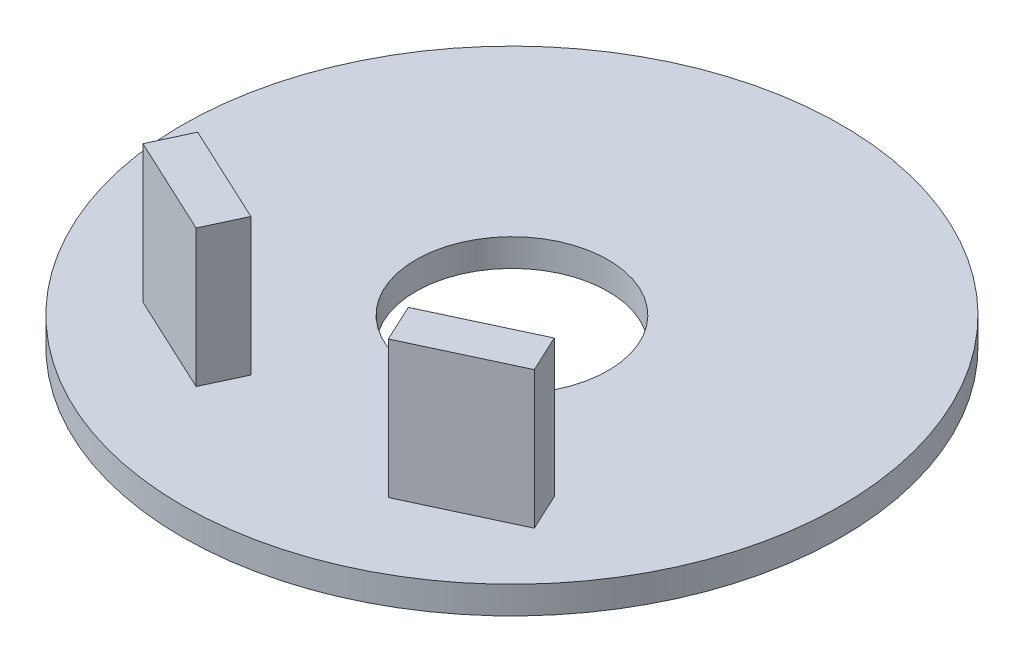
ISO-10303-21;
HEADER;
FILE_DESCRIPTION(('STEP AP214'),'2;1');
FILE_NAME('part.step','',(''),(''),'','','');
FILE_SCHEMA(('AUTOMOTIVE_DESIGN { 1 0 10303 214 1 1 1 1 }'));
ENDSEC;
DATA;
#1=APPLICATION_CONTEXT('core data for automotive mechanical design processes');
#2=APPLICATION_PROTOCOL_DEFINITION('international standard','automotive_design',2000,#1);
#3=PRODUCT_CONTEXT('',#1,'mechanical');
#4=PRODUCT('Part','Part','',(#3));
#5=PRODUCT_RELATED_PRODUCT_CATEGORY('part','',(#4));
#6=PRODUCT_DEFINITION_FORMATION('','',#4);
#7=PRODUCT_DEFINITION_CONTEXT('part definition',#1,'design');
#8=PRODUCT_DEFINITION('design','',#6,#7);
#9=PRODUCT_DEFINITION_SHAPE('','',#8);
#10=(LENGTH_UNIT() NAMED_UNIT(*) SI_UNIT(.MILLI.,.METRE.));
#11=(NAMED_UNIT(*) PLANE_ANGLE_UNIT() SI_UNIT($,.RADIAN.));
#12=(NAMED_UNIT(*) SI_UNIT($,.STERADIAN.) SOLID_ANGLE_UNIT());
#13=UNCERTAINTY_MEASURE_WITH_UNIT(LENGTH_MEASURE(1.E-05),#10,'distance_accuracy_value','');
#14=(GEOMETRIC_REPRESENTATION_CONTEXT(3) GLOBAL_UNCERTAINTY_ASSIGNED_CONTEXT((#13)) GLOBAL_UNIT_ASSIGNED_CONTEXT((#10,
#11,#12)) REPRESENTATION_CONTEXT('',''));
#15=CARTESIAN_POINT('',(0.,0.,0.));
#16=DIRECTION('',(0.,0.,1.));
#17=DIRECTION('',(1.,0.,0.));
#18=AXIS2_PLACEMENT_3D('',#15,#16,#17);
#19=CARTESIAN_POINT('',(0.,0.5,0.));
#20=DIRECTION('',(0.,1.,0.));
#21=DIRECTION('',(0.,0.,1.));
#22=AXIS2_PLACEMENT_3D('',#19,#20,#21);
#23=PLANE('',#22);
#24=CARTESIAN_POINT('',(0.,0.5,0.));
#25=DIRECTION('',(0.,1.,0.));
#26=DIRECTION('',(0.,0.,1.));
#27=AXIS2_PLACEMENT_3D('',#24,#25,#26);
#28=CIRCLE('',#27,12.);
#29=CARTESIAN_POINT('',(0.,0.5,12.));
#30=VERTEX_POINT('',#29);
#31=EDGE_CURVE('E11',#30,#30,#28,.T.);
#32=ORIENTED_EDGE('',*,*,#31,.T.);
#33=EDGE_LOOP('',(#32));
#34=FACE_BOUND('',#33,.T.);
#35=CARTESIAN_POINT('',(0.,0.5,0.));
#36=DIRECTION('',(0.,1.,0.));
#37=DIRECTION('',(0.,0.,1.));
#38=AXIS2_PLACEMENT_3D('',#35,#36,#37);
#39=CIRCLE('',#38,3.5);
#40=CARTESIAN_POINT('',(0.,0.5,3.5));
#41=VERTEX_POINT('',#40);
#42=EDGE_CURVE('E168',#41,#41,#39,.T.);
#43=ORIENTED_EDGE('',*,*,#42,.F.);
#44=EDGE_LOOP('',(#43));
#45=FACE_BOUND('',#44,.T.);
#46=DIRECTION('',(0.906307787036653,0.,0.422618261740693));
#47=VECTOR('',#46,1.);
#48=CARTESIAN_POINT('',(-3.5,0.5,8.));
#49=LINE('',#48,#47);
#50=CARTESIAN_POINT('',(-7.12523114814661,0.5,6.30952695303723));
#51=VERTEX_POINT('',#50);
#52=CARTESIAN_POINT('',(-3.5,0.5,8.));
#53=VERTEX_POINT('',#52);
#54=EDGE_CURVE('E139',#51,#53,#49,.T.);
#55=ORIENTED_EDGE('',*,*,#54,.F.);
#56=DIRECTION('',(-0.422618261740693,0.,0.906307787036653));
#57=VECTOR('',#56,1.);
#58=CARTESIAN_POINT('',(-7.12523114814661,0.5,6.30952695303723));
#59=LINE('',#58,#57);
#60=CARTESIAN_POINT('',(-6.49130375553557,0.5,4.95006527248225));
#61=VERTEX_POINT('',#60);
#62=EDGE_CURVE('E136',#61,#51,#59,.T.);
#63=ORIENTED_EDGE('',*,*,#62,.F.);
#64=DIRECTION('',(-0.906307787036653,0.,-0.422618261740693));
#65=VECTOR('',#64,1.);
#66=CARTESIAN_POINT('',(-6.49130375553557,0.5,4.95006527248225));
#67=LINE('',#66,#65);
#68=CARTESIAN_POINT('',(-2.86607260738896,0.5,6.64053831944502));
#69=VERTEX_POINT('',#68);
#70=EDGE_CURVE('E148',#69,#61,#67,.T.);
#71=ORIENTED_EDGE('',*,*,#70,.F.);
#72=DIRECTION('',(0.422618261740693,0.,-0.906307787036653));
#73=VECTOR('',#72,1.);
#74=CARTESIAN_POINT('',(-2.86607260738896,0.5,6.64053831944502));
#75=LINE('',#74,#73);
#76=EDGE_CURVE('E156',#53,#69,#75,.T.);
#77=ORIENTED_EDGE('',*,*,#76,.F.);
#78=EDGE_LOOP('',(#55,#63,#71,#77));
#79=FACE_BOUND('',#78,.T.);
#80=DIRECTION('',(-0.422618261740693,0.,-0.906307787036653));
#81=VECTOR('',#80,1.);
#82=CARTESIAN_POINT('',(7.12523114814661,0.5,6.30952695303723));
#83=LINE('',#82,#81);
#84=CARTESIAN_POINT('',(7.12523114814661,0.5,6.30952695303723));
#85=VERTEX_POINT('',#84);
#86=CARTESIAN_POINT('',(6.49130375553557,0.5,4.95006527248225));
#87=VERTEX_POINT('',#86);
#88=EDGE_CURVE('E205',#85,#87,#83,.T.);
#89=ORIENTED_EDGE('',*,*,#88,.F.);
#90=DIRECTION('',(0.906307787036653,0.,-0.422618261740693));
#91=VECTOR('',#90,1.);
#92=CARTESIAN_POINT('',(3.5,0.5,8.));
#93=LINE('',#92,#91);
#94=CARTESIAN_POINT('',(3.5,0.5,8.));
#95=VERTEX_POINT('',#94);
#96=EDGE_CURVE('E134',#95,#85,#93,.T.);
#97=ORIENTED_EDGE('',*,*,#96,.F.);
#98=DIRECTION('',(0.422618261740693,0.,0.906307787036653));
#99=VECTOR('',#98,1.);
#100=CARTESIAN_POINT('',(2.86607260738896,0.5,6.64053831944502));
#101=LINE('',#100,#99);
#102=CARTESIAN_POINT('',(2.86607260738896,0.5,6.64053831944502));
#103=VERTEX_POINT('',#102);
#104=EDGE_CURVE('E130',#103,#95,#101,.T.);
#105=ORIENTED_EDGE('',*,*,#104,.F.);
#106=DIRECTION('',(-0.906307787036653,0.,0.422618261740693));
#107=VECTOR('',#106,1.);
#108=CARTESIAN_POINT('',(6.49130375553557,0.5,4.95006527248225));
#109=LINE('',#108,#107);
#110=EDGE_CURVE('E207',#87,#103,#109,.T.);
#111=ORIENTED_EDGE('',*,*,#110,.F.);
#112=EDGE_LOOP('',(#89,#97,#105,#111));
#113=FACE_BOUND('',#112,.T.);
#114=ADVANCED_FACE('F45',(#34,#45,#79,#113),#23,.T.);
#115=CARTESIAN_POINT('',(0.,-0.5,0.));
#116=DIRECTION('',(0.,1.,0.));
#117=DIRECTION('',(0.,0.,1.));
#118=AXIS2_PLACEMENT_3D('',#115,#116,#117);
#119=PLANE('',#118);
#120=CARTESIAN_POINT('',(0.,-0.5,0.));
#121=DIRECTION('',(0.,1.,0.));
#122=DIRECTION('',(0.,0.,1.));
#123=AXIS2_PLACEMENT_3D('',#120,#121,#122);
#124=CIRCLE('',#123,12.);
#125=CARTESIAN_POINT('',(0.,-0.5,12.));
#126=VERTEX_POINT('',#125);
#127=EDGE_CURVE('E49',#126,#126,#124,.T.);
#128=ORIENTED_EDGE('',*,*,#127,.F.);
#129=EDGE_LOOP('',(#128));
#130=FACE_BOUND('',#129,.T.);
#131=CARTESIAN_POINT('',(0.,-0.5,0.));
#132=DIRECTION('',(0.,1.,0.));
#133=DIRECTION('',(0.,0.,1.));
#134=AXIS2_PLACEMENT_3D('',#131,#132,#133);
#135=CIRCLE('',#134,3.5);
#136=CARTESIAN_POINT('',(0.,-0.5,3.5));
#137=VERTEX_POINT('',#136);
#138=EDGE_CURVE('E167',#137,#137,#135,.T.);
#139=ORIENTED_EDGE('',*,*,#138,.T.);
#140=EDGE_LOOP('',(#139));
#141=FACE_BOUND('',#140,.T.);
#142=ADVANCED_FACE('F174',(#130,#141),#119,.F.);
#143=CARTESIAN_POINT('',(0.,0.5,0.));
#144=DIRECTION('',(0.,-1.,0.));
#145=DIRECTION('',(0.,0.,-1.));
#146=AXIS2_PLACEMENT_3D('',#143,#144,#145);
#147=CYLINDRICAL_SURFACE('',#146,12.);
#148=ORIENTED_EDGE('',*,*,#31,.F.);
#149=EDGE_LOOP('',(#148));
#150=FACE_BOUND('',#149,.T.);
#151=ORIENTED_EDGE('',*,*,#127,.T.);
#152=EDGE_LOOP('',(#151));
#153=FACE_BOUND('',#152,.T.);
#154=ADVANCED_FACE('F47',(#150,#153),#147,.T.);
#155=CARTESIAN_POINT('',(0.,0.5,0.));
#156=DIRECTION('',(0.,-1.,0.));
#157=DIRECTION('',(0.,0.,-1.));
#158=AXIS2_PLACEMENT_3D('',#155,#156,#157);
#159=CYLINDRICAL_SURFACE('',#158,3.5);
#160=ORIENTED_EDGE('',*,*,#42,.T.);
#161=EDGE_LOOP('',(#160));
#162=FACE_BOUND('',#161,.T.);
#163=ORIENTED_EDGE('',*,*,#138,.F.);
#164=EDGE_LOOP('',(#163));
#165=FACE_BOUND('',#164,.T.);
#166=ADVANCED_FACE('F176',(#162,#165),#159,.F.);
#167=CARTESIAN_POINT('',(-7.12523114814661,5.5,6.30952695303723));
#168=DIRECTION('',(0.906307787036653,0.,0.422618261740693));
#169=DIRECTION('',(0.422618261740693,0.,-0.906307787036653));
#170=AXIS2_PLACEMENT_3D('',#167,#168,#169);
#171=PLANE('',#170);
#172=ORIENTED_EDGE('',*,*,#62,.T.);
#173=DIRECTION('',(0.,-1.,0.));
#174=VECTOR('',#173,1.);
#175=CARTESIAN_POINT('',(-7.12523114814661,5.5,6.30952695303723));
#176=LINE('',#175,#174);
#177=CARTESIAN_POINT('',(-7.12523114814661,5.5,6.30952695303723));
#178=VERTEX_POINT('',#177);
#179=EDGE_CURVE('E165',#178,#51,#176,.T.);
#180=ORIENTED_EDGE('',*,*,#179,.F.);
#181=DIRECTION('',(-0.422618261740693,0.,0.906307787036653));
#182=VECTOR('',#181,1.);
#183=CARTESIAN_POINT('',(-7.12523114814661,5.5,6.30952695303723));
#184=LINE('',#183,#182);
#185=CARTESIAN_POINT('',(-6.49130375553557,5.5,4.95006527248225));
#186=VERTEX_POINT('',#185);
#187=EDGE_CURVE('E144',#186,#178,#184,.T.);
#188=ORIENTED_EDGE('',*,*,#187,.F.);
#189=DIRECTION('',(0.,-1.,0.));
#190=VECTOR('',#189,1.);
#191=CARTESIAN_POINT('',(-6.49130375553557,5.5,4.95006527248225));
#192=LINE('',#191,#190);
#193=EDGE_CURVE('E153',#186,#61,#192,.T.);
#194=ORIENTED_EDGE('',*,*,#193,.T.);
#195=EDGE_LOOP('',(#172,#180,#188,#194));
#196=FACE_BOUND('',#195,.T.);
#197=ADVANCED_FACE('F178',(#196),#171,.F.);
#198=CARTESIAN_POINT('',(-3.5,5.5,8.));
#199=DIRECTION('',(0.422618261740693,0.,-0.906307787036653));
#200=DIRECTION('',(-0.906307787036653,0.,-0.422618261740693));
#201=AXIS2_PLACEMENT_3D('',#198,#199,#200);
#202=PLANE('',#201);
#203=ORIENTED_EDGE('',*,*,#54,.T.);
#204=DIRECTION('',(0.,-1.,0.));
#205=VECTOR('',#204,1.);
#206=CARTESIAN_POINT('',(-3.5,5.5,8.));
#207=LINE('',#206,#205);
#208=CARTESIAN_POINT('',(-3.5,5.5,8.));
#209=VERTEX_POINT('',#208);
#210=EDGE_CURVE('E162',#209,#53,#207,.T.);
#211=ORIENTED_EDGE('',*,*,#210,.F.);
#212=DIRECTION('',(0.906307787036653,0.,0.422618261740693));
#213=VECTOR('',#212,1.);
#214=CARTESIAN_POINT('',(-3.5,5.5,8.));
#215=LINE('',#214,#213);
#216=EDGE_CURVE('E147',#178,#209,#215,.T.);
#217=ORIENTED_EDGE('',*,*,#216,.F.);
#218=ORIENTED_EDGE('',*,*,#179,.T.);
#219=EDGE_LOOP('',(#203,#211,#217,#218));
#220=FACE_BOUND('',#219,.T.);
#221=ADVANCED_FACE('F185',(#220),#202,.F.);
#222=CARTESIAN_POINT('',(-2.86607260738896,5.5,6.64053831944502));
#223=DIRECTION('',(-0.906307787036653,0.,-0.422618261740693));
#224=DIRECTION('',(-0.422618261740693,0.,0.906307787036653));
#225=AXIS2_PLACEMENT_3D('',#222,#223,#224);
#226=PLANE('',#225);
#227=ORIENTED_EDGE('',*,*,#76,.T.);
#228=DIRECTION('',(0.,-1.,0.));
#229=VECTOR('',#228,1.);
#230=CARTESIAN_POINT('',(-2.86607260738896,5.5,6.64053831944502));
#231=LINE('',#230,#229);
#232=CARTESIAN_POINT('',(-2.86607260738896,5.5,6.64053831944502));
#233=VERTEX_POINT('',#232);
#234=EDGE_CURVE('E68',#233,#69,#231,.T.);
#235=ORIENTED_EDGE('',*,*,#234,.F.);
#236=DIRECTION('',(0.422618261740693,0.,-0.906307787036653));
#237=VECTOR('',#236,1.);
#238=CARTESIAN_POINT('',(-2.86607260738896,5.5,6.64053831944502));
#239=LINE('',#238,#237);
#240=EDGE_CURVE('E150',#209,#233,#239,.T.);
#241=ORIENTED_EDGE('',*,*,#240,.F.);
#242=ORIENTED_EDGE('',*,*,#210,.T.);
#243=EDGE_LOOP('',(#227,#235,#241,#242));
#244=FACE_BOUND('',#243,.T.);
#245=ADVANCED_FACE('F239',(#244),#226,.F.);
#246=CARTESIAN_POINT('',(-6.49130375553557,5.5,4.95006527248225));
#247=DIRECTION('',(-0.422618261740693,0.,0.906307787036653));
#248=DIRECTION('',(0.906307787036653,0.,0.422618261740693));
#249=AXIS2_PLACEMENT_3D('',#246,#247,#248);
#250=PLANE('',#249);
#251=ORIENTED_EDGE('',*,*,#70,.T.);
#252=ORIENTED_EDGE('',*,*,#193,.F.);
#253=DIRECTION('',(-0.906307787036653,0.,-0.422618261740693));
#254=VECTOR('',#253,1.);
#255=CARTESIAN_POINT('',(-6.49130375553557,5.5,4.95006527248225));
#256=LINE('',#255,#254);
#257=EDGE_CURVE('E152',#233,#186,#256,.T.);
#258=ORIENTED_EDGE('',*,*,#257,.F.);
#259=ORIENTED_EDGE('',*,*,#234,.T.);
#260=EDGE_LOOP('',(#251,#252,#258,#259));
#261=FACE_BOUND('',#260,.T.);
#262=ADVANCED_FACE('F235',(#261),#250,.F.);
#263=CARTESIAN_POINT('',(0.,5.5,0.));
#264=DIRECTION('',(0.,-1.,0.));
#265=DIRECTION('',(0.,0.,-1.));
#266=AXIS2_PLACEMENT_3D('',#263,#264,#265);
#267=PLANE('',#266);
#268=ORIENTED_EDGE('',*,*,#187,.T.);
#269=ORIENTED_EDGE('',*,*,#216,.T.);
#270=ORIENTED_EDGE('',*,*,#240,.T.);
#271=ORIENTED_EDGE('',*,*,#257,.T.);
#272=EDGE_LOOP('',(#268,#269,#270,#271));
#273=FACE_BOUND('',#272,.T.);
#274=ADVANCED_FACE('F232',(#273),#267,.F.);
#275=CARTESIAN_POINT('',(3.5,5.5,8.));
#276=DIRECTION('',(-0.422618261740693,0.,-0.906307787036653));
#277=DIRECTION('',(-0.906307787036653,0.,0.422618261740693));
#278=AXIS2_PLACEMENT_3D('',#275,#276,#277);
#279=PLANE('',#278);
#280=ORIENTED_EDGE('',*,*,#96,.T.);
#281=DIRECTION('',(0.,-1.,0.));
#282=VECTOR('',#281,1.);
#283=CARTESIAN_POINT('',(7.12523114814661,5.5,6.30952695303723));
#284=LINE('',#283,#282);
#285=CARTESIAN_POINT('',(7.12523114814661,5.5,6.30952695303723));
#286=VERTEX_POINT('',#285);
#287=EDGE_CURVE('E115',#286,#85,#284,.T.);
#288=ORIENTED_EDGE('',*,*,#287,.F.);
#289=DIRECTION('',(0.906307787036653,0.,-0.422618261740693));
#290=VECTOR('',#289,1.);
#291=CARTESIAN_POINT('',(3.5,5.5,8.));
#292=LINE('',#291,#290);
#293=CARTESIAN_POINT('',(3.5,5.5,8.));
#294=VERTEX_POINT('',#293);
#295=EDGE_CURVE('E122',#294,#286,#292,.T.);
#296=ORIENTED_EDGE('',*,*,#295,.F.);
#297=DIRECTION('',(0.,-1.,0.));
#298=VECTOR('',#297,1.);
#299=CARTESIAN_POINT('',(3.5,5.5,8.));
#300=LINE('',#299,#298);
#301=EDGE_CURVE('E214',#294,#95,#300,.T.);
#302=ORIENTED_EDGE('',*,*,#301,.T.);
#303=EDGE_LOOP('',(#280,#288,#296,#302));
#304=FACE_BOUND('',#303,.T.);
#305=ADVANCED_FACE('F132',(#304),#279,.F.);
#306=CARTESIAN_POINT('',(7.12523114814661,5.5,6.30952695303723));
#307=DIRECTION('',(-0.906307787036653,0.,0.422618261740693));
#308=DIRECTION('',(0.422618261740693,0.,0.906307787036653));
#309=AXIS2_PLACEMENT_3D('',#306,#307,#308);
#310=PLANE('',#309);
#311=ORIENTED_EDGE('',*,*,#88,.T.);
#312=DIRECTION('',(0.,-1.,0.));
#313=VECTOR('',#312,1.);
#314=CARTESIAN_POINT('',(6.49130375553557,5.5,4.95006527248225));
#315=LINE('',#314,#313);
#316=CARTESIAN_POINT('',(6.49130375553557,5.5,4.95006527248225));
#317=VERTEX_POINT('',#316);
#318=EDGE_CURVE('E118',#317,#87,#315,.T.);
#319=ORIENTED_EDGE('',*,*,#318,.F.);
#320=DIRECTION('',(-0.422618261740693,0.,-0.906307787036653));
#321=VECTOR('',#320,1.);
#322=CARTESIAN_POINT('',(7.12523114814661,5.5,6.30952695303723));
#323=LINE('',#322,#321);
#324=EDGE_CURVE('E111',#286,#317,#323,.T.);
#325=ORIENTED_EDGE('',*,*,#324,.F.);
#326=ORIENTED_EDGE('',*,*,#287,.T.);
#327=EDGE_LOOP('',(#311,#319,#325,#326));
#328=FACE_BOUND('',#327,.T.);
#329=ADVANCED_FACE('F113',(#328),#310,.F.);
#330=CARTESIAN_POINT('',(6.49130375553557,5.5,4.95006527248225));
#331=DIRECTION('',(0.422618261740693,0.,0.906307787036653));
#332=DIRECTION('',(0.906307787036653,0.,-0.422618261740693));
#333=AXIS2_PLACEMENT_3D('',#330,#331,#332);
#334=PLANE('',#333);
#335=ORIENTED_EDGE('',*,*,#110,.T.);
#336=DIRECTION('',(0.,-1.,0.));
#337=VECTOR('',#336,1.);
#338=CARTESIAN_POINT('',(2.86607260738896,5.5,6.64053831944502));
#339=LINE('',#338,#337);
#340=CARTESIAN_POINT('',(2.86607260738896,5.5,6.64053831944502));
#341=VERTEX_POINT('',#340);
#342=EDGE_CURVE('E60',#341,#103,#339,.T.);
#343=ORIENTED_EDGE('',*,*,#342,.F.);
#344=DIRECTION('',(-0.906307787036653,0.,0.422618261740693));
#345=VECTOR('',#344,1.);
#346=CARTESIAN_POINT('',(6.49130375553557,5.5,4.95006527248225));
#347=LINE('',#346,#345);
#348=EDGE_CURVE('E121',#317,#341,#347,.T.);
#349=ORIENTED_EDGE('',*,*,#348,.F.);
#350=ORIENTED_EDGE('',*,*,#318,.T.);
#351=EDGE_LOOP('',(#335,#343,#349,#350));
#352=FACE_BOUND('',#351,.T.);
#353=ADVANCED_FACE('F217',(#352),#334,.F.);
#354=CARTESIAN_POINT('',(2.86607260738896,5.5,6.64053831944502));
#355=DIRECTION('',(0.906307787036653,0.,-0.422618261740693));
#356=DIRECTION('',(-0.422618261740693,0.,-0.906307787036653));
#357=AXIS2_PLACEMENT_3D('',#354,#355,#356);
#358=PLANE('',#357);
#359=ORIENTED_EDGE('',*,*,#104,.T.);
#360=ORIENTED_EDGE('',*,*,#301,.F.);
#361=DIRECTION('',(0.422618261740693,0.,0.906307787036653));
#362=VECTOR('',#361,1.);
#363=CARTESIAN_POINT('',(2.86607260738896,5.5,6.64053831944502));
#364=LINE('',#363,#362);
#365=EDGE_CURVE('E126',#341,#294,#364,.T.);
#366=ORIENTED_EDGE('',*,*,#365,.F.);
#367=ORIENTED_EDGE('',*,*,#342,.T.);
#368=EDGE_LOOP('',(#359,#360,#366,#367));
#369=FACE_BOUND('',#368,.T.);
#370=ADVANCED_FACE('F218',(#369),#358,.F.);
#371=CARTESIAN_POINT('',(0.,5.5,0.));
#372=DIRECTION('',(0.,1.,0.));
#373=DIRECTION('',(0.,0.,1.));
#374=AXIS2_PLACEMENT_3D('',#371,#372,#373);
#375=PLANE('',#374);
#376=ORIENTED_EDGE('',*,*,#295,.T.);
#377=ORIENTED_EDGE('',*,*,#324,.T.);
#378=ORIENTED_EDGE('',*,*,#348,.T.);
#379=ORIENTED_EDGE('',*,*,#365,.T.);
#380=EDGE_LOOP('',(#376,#377,#378,#379));
#381=FACE_BOUND('',#380,.T.);
#382=ADVANCED_FACE('F125',(#381),#375,.T.);
#383=CLOSED_SHELL('',(#114,#142,#154,#166,#197,#221,#245,#262,#274,#305,#329,#353,#370,#382));
#384=MANIFOLD_SOLID_BREP('B2',#383);
#385=ADVANCED_BREP_SHAPE_REPRESENTATION('',(#18,#384),#14);
#386=SHAPE_DEFINITION_REPRESENTATION(#9,#385);
ENDSEC;
END-ISO-10303-21;
